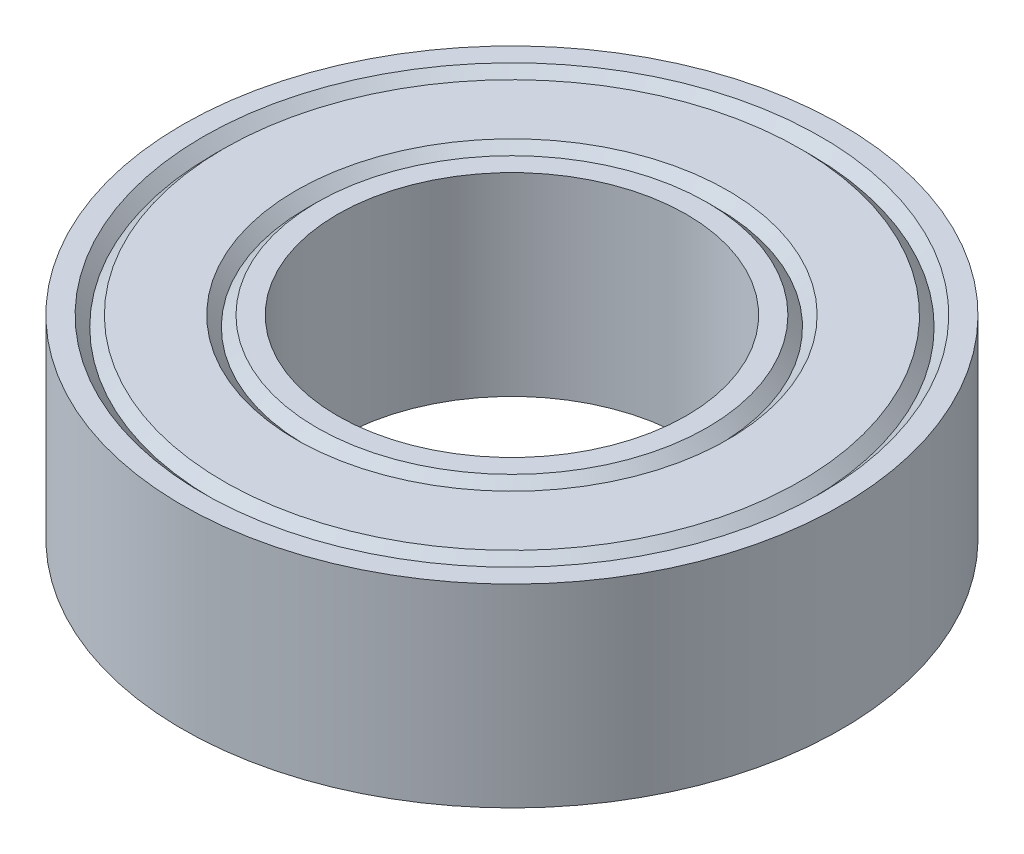
ISO-10303-21;
HEADER;
FILE_DESCRIPTION(('STEP AP214'),'2;1');
FILE_NAME('part.step','',(''),(''),'','','');
FILE_SCHEMA(('AUTOMOTIVE_DESIGN { 1 0 10303 214 1 1 1 1 }'));
ENDSEC;
DATA;
#1=APPLICATION_CONTEXT('core data for automotive mechanical design processes');
#2=APPLICATION_PROTOCOL_DEFINITION('international standard','automotive_design',2000,#1);
#3=PRODUCT_CONTEXT('',#1,'mechanical');
#4=PRODUCT('Part','Part','',(#3));
#5=PRODUCT_RELATED_PRODUCT_CATEGORY('part','',(#4));
#6=PRODUCT_DEFINITION_FORMATION('','',#4);
#7=PRODUCT_DEFINITION_CONTEXT('part definition',#1,'design');
#8=PRODUCT_DEFINITION('design','',#6,#7);
#9=PRODUCT_DEFINITION_SHAPE('','',#8);
#10=(LENGTH_UNIT() NAMED_UNIT(*) SI_UNIT(.MILLI.,.METRE.));
#11=(NAMED_UNIT(*) PLANE_ANGLE_UNIT() SI_UNIT($,.RADIAN.));
#12=(NAMED_UNIT(*) SI_UNIT($,.STERADIAN.) SOLID_ANGLE_UNIT());
#13=UNCERTAINTY_MEASURE_WITH_UNIT(LENGTH_MEASURE(1.E-05),#10,'distance_accuracy_value','');
#14=(GEOMETRIC_REPRESENTATION_CONTEXT(3) GLOBAL_UNCERTAINTY_ASSIGNED_CONTEXT((#13)) GLOBAL_UNIT_ASSIGNED_CONTEXT((#10,
#11,#12)) REPRESENTATION_CONTEXT('',''));
#15=CARTESIAN_POINT('',(0.,0.,0.));
#16=DIRECTION('',(0.,0.,1.));
#17=DIRECTION('',(1.,0.,0.));
#18=AXIS2_PLACEMENT_3D('',#15,#16,#17);
#19=CARTESIAN_POINT('',(0.,2.5,0.));
#20=DIRECTION('',(0.,1.,0.));
#21=DIRECTION('',(-1.,0.,0.));
#22=AXIS2_PLACEMENT_3D('',#19,#20,#21);
#23=CYLINDRICAL_SURFACE('',#22,4.5);
#24=CARTESIAN_POINT('',(0.,2.5,0.));
#25=DIRECTION('',(0.,1.,0.));
#26=DIRECTION('',(-1.,0.,0.));
#27=AXIS2_PLACEMENT_3D('',#24,#25,#26);
#28=CIRCLE('',#27,4.5);
#29=CARTESIAN_POINT('',(-4.5,2.5,0.));
#30=VERTEX_POINT('',#29);
#31=EDGE_CURVE('E83',#30,#30,#28,.T.);
#32=ORIENTED_EDGE('',*,*,#31,.T.);
#33=EDGE_LOOP('',(#32));
#34=FACE_BOUND('',#33,.T.);
#35=CARTESIAN_POINT('',(0.,-2.49999999999999,0.));
#36=DIRECTION('',(0.,1.,0.));
#37=DIRECTION('',(-1.,0.,0.));
#38=AXIS2_PLACEMENT_3D('',#35,#36,#37);
#39=CIRCLE('',#38,4.5);
#40=CARTESIAN_POINT('',(-4.5,-2.5,0.));
#41=VERTEX_POINT('',#40);
#42=EDGE_CURVE('E10',#41,#41,#39,.T.);
#43=ORIENTED_EDGE('',*,*,#42,.F.);
#44=EDGE_LOOP('',(#43));
#45=FACE_BOUND('',#44,.T.);
#46=ADVANCED_FACE('F31',(#34,#45),#23,.F.);
#47=CARTESIAN_POINT('',(-4.5,-2.5,0.));
#48=DIRECTION('',(0.,-1.,0.));
#49=DIRECTION('',(1.,0.,0.));
#50=AXIS2_PLACEMENT_3D('',#47,#48,#49);
#51=PLANE('',#50);
#52=ORIENTED_EDGE('',*,*,#42,.T.);
#53=EDGE_LOOP('',(#52));
#54=FACE_BOUND('',#53,.T.);
#55=CARTESIAN_POINT('',(0.,-2.49999999999999,0.));
#56=DIRECTION('',(0.,1.,0.));
#57=DIRECTION('',(-1.,0.,0.));
#58=AXIS2_PLACEMENT_3D('',#55,#56,#57);
#59=CIRCLE('',#58,5.03333333333334);
#60=CARTESIAN_POINT('',(-5.03333333333334,-2.49999999999999,0.));
#61=VERTEX_POINT('',#60);
#62=EDGE_CURVE('E37',#61,#61,#59,.T.);
#63=ORIENTED_EDGE('',*,*,#62,.F.);
#64=EDGE_LOOP('',(#63));
#65=FACE_BOUND('',#64,.T.);
#66=ADVANCED_FACE('F101',(#54,#65),#51,.T.);
#67=CARTESIAN_POINT('',(0.,-2.23333333333332,0.));
#68=DIRECTION('',(0.,1.,0.));
#69=DIRECTION('',(-1.,0.,0.));
#70=AXIS2_PLACEMENT_3D('',#67,#68,#69);
#71=CONICAL_SURFACE('',#70,5.3,0.785398163397442);
#72=ORIENTED_EDGE('',*,*,#62,.T.);
#73=EDGE_LOOP('',(#72));
#74=FACE_BOUND('',#73,.T.);
#75=CARTESIAN_POINT('',(0.,-2.23333333333332,0.));
#76=DIRECTION('',(0.,1.,0.));
#77=DIRECTION('',(-1.,0.,0.));
#78=AXIS2_PLACEMENT_3D('',#75,#76,#77);
#79=CIRCLE('',#78,5.3);
#80=CARTESIAN_POINT('',(-5.3,-2.23333333333333,0.));
#81=VERTEX_POINT('',#80);
#82=EDGE_CURVE('E41',#81,#81,#79,.T.);
#83=ORIENTED_EDGE('',*,*,#82,.F.);
#84=EDGE_LOOP('',(#83));
#85=FACE_BOUND('',#84,.T.);
#86=ADVANCED_FACE('F105',(#74,#85),#71,.T.);
#87=CARTESIAN_POINT('',(0.,-2.5,0.));
#88=DIRECTION('',(0.,-1.,0.));
#89=DIRECTION('',(1.,0.,0.));
#90=AXIS2_PLACEMENT_3D('',#87,#88,#89);
#91=CONICAL_SURFACE('',#90,5.56666666666668,0.785398163397457);
#92=ORIENTED_EDGE('',*,*,#82,.T.);
#93=EDGE_LOOP('',(#92));
#94=FACE_BOUND('',#93,.T.);
#95=CARTESIAN_POINT('',(0.,-2.5,0.));
#96=DIRECTION('',(0.,1.,0.));
#97=DIRECTION('',(-1.,0.,0.));
#98=AXIS2_PLACEMENT_3D('',#95,#96,#97);
#99=CIRCLE('',#98,5.56666666666668);
#100=CARTESIAN_POINT('',(-5.56666666666668,-2.5,0.));
#101=VERTEX_POINT('',#100);
#102=EDGE_CURVE('E45',#101,#101,#99,.T.);
#103=ORIENTED_EDGE('',*,*,#102,.F.);
#104=EDGE_LOOP('',(#103));
#105=FACE_BOUND('',#104,.T.);
#106=ADVANCED_FACE('F109',(#94,#105),#91,.F.);
#107=CARTESIAN_POINT('',(-5.56666666666668,-2.49999999999999,0.));
#108=DIRECTION('',(0.,-1.,0.));
#109=DIRECTION('',(1.,0.,0.));
#110=AXIS2_PLACEMENT_3D('',#107,#108,#109);
#111=PLANE('',#110);
#112=ORIENTED_EDGE('',*,*,#102,.T.);
#113=EDGE_LOOP('',(#112));
#114=FACE_BOUND('',#113,.T.);
#115=CARTESIAN_POINT('',(0.,-2.49999999999999,0.));
#116=DIRECTION('',(0.,1.,0.));
#117=DIRECTION('',(-1.,0.,0.));
#118=AXIS2_PLACEMENT_3D('',#115,#116,#117);
#119=CIRCLE('',#118,7.43333333333333);
#120=CARTESIAN_POINT('',(-7.43333333333333,-2.49999999999999,0.));
#121=VERTEX_POINT('',#120);
#122=EDGE_CURVE('E50',#121,#121,#119,.T.);
#123=ORIENTED_EDGE('',*,*,#122,.F.);
#124=EDGE_LOOP('',(#123));
#125=FACE_BOUND('',#124,.T.);
#126=ADVANCED_FACE('F115',(#114,#125),#111,.T.);
#127=CARTESIAN_POINT('',(0.,-2.23333333333332,0.));
#128=DIRECTION('',(0.,1.,0.));
#129=DIRECTION('',(-1.,0.,0.));
#130=AXIS2_PLACEMENT_3D('',#127,#128,#129);
#131=CONICAL_SURFACE('',#130,7.7,0.785398163397461);
#132=ORIENTED_EDGE('',*,*,#122,.T.);
#133=EDGE_LOOP('',(#132));
#134=FACE_BOUND('',#133,.T.);
#135=CARTESIAN_POINT('',(0.,-2.23333333333332,0.));
#136=DIRECTION('',(0.,1.,0.));
#137=DIRECTION('',(-1.,0.,0.));
#138=AXIS2_PLACEMENT_3D('',#135,#136,#137);
#139=CIRCLE('',#138,7.7);
#140=CARTESIAN_POINT('',(-7.7,-2.23333333333333,0.));
#141=VERTEX_POINT('',#140);
#142=EDGE_CURVE('E53',#141,#141,#139,.T.);
#143=ORIENTED_EDGE('',*,*,#142,.F.);
#144=EDGE_LOOP('',(#143));
#145=FACE_BOUND('',#144,.T.);
#146=ADVANCED_FACE('F119',(#134,#145),#131,.T.);
#147=CARTESIAN_POINT('',(0.,-2.49999999999999,0.));
#148=DIRECTION('',(0.,-1.,0.));
#149=DIRECTION('',(1.,0.,0.));
#150=AXIS2_PLACEMENT_3D('',#147,#148,#149);
#151=CONICAL_SURFACE('',#150,7.96666666666667,0.785398163397442);
#152=ORIENTED_EDGE('',*,*,#142,.T.);
#153=EDGE_LOOP('',(#152));
#154=FACE_BOUND('',#153,.T.);
#155=CARTESIAN_POINT('',(0.,-2.49999999999999,0.));
#156=DIRECTION('',(0.,1.,0.));
#157=DIRECTION('',(-1.,0.,0.));
#158=AXIS2_PLACEMENT_3D('',#155,#156,#157);
#159=CIRCLE('',#158,7.96666666666667);
#160=CARTESIAN_POINT('',(-7.96666666666667,-2.5,0.));
#161=VERTEX_POINT('',#160);
#162=EDGE_CURVE('E56',#161,#161,#159,.T.);
#163=ORIENTED_EDGE('',*,*,#162,.F.);
#164=EDGE_LOOP('',(#163));
#165=FACE_BOUND('',#164,.T.);
#166=ADVANCED_FACE('F123',(#154,#165),#151,.F.);
#167=CARTESIAN_POINT('',(-7.96666666666667,-2.5,0.));
#168=DIRECTION('',(0.,-1.,0.));
#169=DIRECTION('',(1.,0.,0.));
#170=AXIS2_PLACEMENT_3D('',#167,#168,#169);
#171=PLANE('',#170);
#172=ORIENTED_EDGE('',*,*,#162,.T.);
#173=EDGE_LOOP('',(#172));
#174=FACE_BOUND('',#173,.T.);
#175=CARTESIAN_POINT('',(0.,-2.49999999999999,0.));
#176=DIRECTION('',(0.,1.,0.));
#177=DIRECTION('',(-1.,0.,0.));
#178=AXIS2_PLACEMENT_3D('',#175,#176,#177);
#179=CIRCLE('',#178,8.5);
#180=CARTESIAN_POINT('',(-8.5,-2.5,0.));
#181=VERTEX_POINT('',#180);
#182=EDGE_CURVE('E59',#181,#181,#179,.T.);
#183=ORIENTED_EDGE('',*,*,#182,.F.);
#184=EDGE_LOOP('',(#183));
#185=FACE_BOUND('',#184,.T.);
#186=ADVANCED_FACE('F127',(#174,#185),#171,.T.);
#187=CARTESIAN_POINT('',(0.,2.5,0.));
#188=DIRECTION('',(0.,1.,0.));
#189=DIRECTION('',(-1.,0.,0.));
#190=AXIS2_PLACEMENT_3D('',#187,#188,#189);
#191=CYLINDRICAL_SURFACE('',#190,8.5);
#192=ORIENTED_EDGE('',*,*,#182,.T.);
#193=EDGE_LOOP('',(#192));
#194=FACE_BOUND('',#193,.T.);
#195=CARTESIAN_POINT('',(0.,2.5,0.));
#196=DIRECTION('',(0.,1.,0.));
#197=DIRECTION('',(-1.,0.,0.));
#198=AXIS2_PLACEMENT_3D('',#195,#196,#197);
#199=CIRCLE('',#198,8.5);
#200=CARTESIAN_POINT('',(-8.5,2.5,0.));
#201=VERTEX_POINT('',#200);
#202=EDGE_CURVE('E62',#201,#201,#199,.T.);
#203=ORIENTED_EDGE('',*,*,#202,.F.);
#204=EDGE_LOOP('',(#203));
#205=FACE_BOUND('',#204,.T.);
#206=ADVANCED_FACE('F131',(#194,#205),#191,.T.);
#207=CARTESIAN_POINT('',(-7.96666666666667,2.5,0.));
#208=DIRECTION('',(0.,1.,0.));
#209=DIRECTION('',(-1.,0.,0.));
#210=AXIS2_PLACEMENT_3D('',#207,#208,#209);
#211=PLANE('',#210);
#212=ORIENTED_EDGE('',*,*,#202,.T.);
#213=EDGE_LOOP('',(#212));
#214=FACE_BOUND('',#213,.T.);
#215=CARTESIAN_POINT('',(0.,2.5,0.));
#216=DIRECTION('',(0.,1.,0.));
#217=DIRECTION('',(-1.,0.,0.));
#218=AXIS2_PLACEMENT_3D('',#215,#216,#217);
#219=CIRCLE('',#218,7.96666666666667);
#220=CARTESIAN_POINT('',(-7.96666666666667,2.5,0.));
#221=VERTEX_POINT('',#220);
#222=EDGE_CURVE('E65',#221,#221,#219,.T.);
#223=ORIENTED_EDGE('',*,*,#222,.F.);
#224=EDGE_LOOP('',(#223));
#225=FACE_BOUND('',#224,.T.);
#226=ADVANCED_FACE('F135',(#214,#225),#211,.T.);
#227=CARTESIAN_POINT('',(0.,2.23333333333333,0.));
#228=DIRECTION('',(0.,1.,0.));
#229=DIRECTION('',(-1.,0.,0.));
#230=AXIS2_PLACEMENT_3D('',#227,#228,#229);
#231=CONICAL_SURFACE('',#230,7.7,0.785398163397441);
#232=ORIENTED_EDGE('',*,*,#222,.T.);
#233=EDGE_LOOP('',(#232));
#234=FACE_BOUND('',#233,.T.);
#235=CARTESIAN_POINT('',(0.,2.23333333333333,0.));
#236=DIRECTION('',(0.,1.,0.));
#237=DIRECTION('',(-1.,0.,0.));
#238=AXIS2_PLACEMENT_3D('',#235,#236,#237);
#239=CIRCLE('',#238,7.7);
#240=CARTESIAN_POINT('',(-7.7,2.23333333333333,0.));
#241=VERTEX_POINT('',#240);
#242=EDGE_CURVE('E68',#241,#241,#239,.T.);
#243=ORIENTED_EDGE('',*,*,#242,.F.);
#244=EDGE_LOOP('',(#243));
#245=FACE_BOUND('',#244,.T.);
#246=ADVANCED_FACE('F139',(#234,#245),#231,.F.);
#247=CARTESIAN_POINT('',(0.,2.5,0.));
#248=DIRECTION('',(0.,-1.,0.));
#249=DIRECTION('',(1.,0.,0.));
#250=AXIS2_PLACEMENT_3D('',#247,#248,#249);
#251=CONICAL_SURFACE('',#250,7.43333333333333,0.785398163397464);
#252=ORIENTED_EDGE('',*,*,#242,.T.);
#253=EDGE_LOOP('',(#252));
#254=FACE_BOUND('',#253,.T.);
#255=CARTESIAN_POINT('',(0.,2.5,0.));
#256=DIRECTION('',(0.,1.,0.));
#257=DIRECTION('',(-1.,0.,0.));
#258=AXIS2_PLACEMENT_3D('',#255,#256,#257);
#259=CIRCLE('',#258,7.43333333333333);
#260=CARTESIAN_POINT('',(-7.43333333333333,2.49999999999999,0.));
#261=VERTEX_POINT('',#260);
#262=EDGE_CURVE('E71',#261,#261,#259,.T.);
#263=ORIENTED_EDGE('',*,*,#262,.F.);
#264=EDGE_LOOP('',(#263));
#265=FACE_BOUND('',#264,.T.);
#266=ADVANCED_FACE('F143',(#254,#265),#251,.T.);
#267=CARTESIAN_POINT('',(-5.56666666666668,2.5,0.));
#268=DIRECTION('',(0.,1.,0.));
#269=DIRECTION('',(-1.,0.,0.));
#270=AXIS2_PLACEMENT_3D('',#267,#268,#269);
#271=PLANE('',#270);
#272=ORIENTED_EDGE('',*,*,#262,.T.);
#273=EDGE_LOOP('',(#272));
#274=FACE_BOUND('',#273,.T.);
#275=CARTESIAN_POINT('',(0.,2.5,0.));
#276=DIRECTION('',(0.,1.,0.));
#277=DIRECTION('',(-1.,0.,0.));
#278=AXIS2_PLACEMENT_3D('',#275,#276,#277);
#279=CIRCLE('',#278,5.56666666666668);
#280=CARTESIAN_POINT('',(-5.56666666666668,2.5,0.));
#281=VERTEX_POINT('',#280);
#282=EDGE_CURVE('E74',#281,#281,#279,.T.);
#283=ORIENTED_EDGE('',*,*,#282,.F.);
#284=EDGE_LOOP('',(#283));
#285=FACE_BOUND('',#284,.T.);
#286=ADVANCED_FACE('F147',(#274,#285),#271,.T.);
#287=CARTESIAN_POINT('',(0.,2.23333333333333,0.));
#288=DIRECTION('',(0.,1.,0.));
#289=DIRECTION('',(-1.,0.,0.));
#290=AXIS2_PLACEMENT_3D('',#287,#288,#289);
#291=CONICAL_SURFACE('',#290,5.3,0.785398163397459);
#292=ORIENTED_EDGE('',*,*,#282,.T.);
#293=EDGE_LOOP('',(#292));
#294=FACE_BOUND('',#293,.T.);
#295=CARTESIAN_POINT('',(0.,2.23333333333333,0.));
#296=DIRECTION('',(0.,1.,0.));
#297=DIRECTION('',(-1.,0.,0.));
#298=AXIS2_PLACEMENT_3D('',#295,#296,#297);
#299=CIRCLE('',#298,5.3);
#300=CARTESIAN_POINT('',(-5.3,2.23333333333333,0.));
#301=VERTEX_POINT('',#300);
#302=EDGE_CURVE('E77',#301,#301,#299,.T.);
#303=ORIENTED_EDGE('',*,*,#302,.F.);
#304=EDGE_LOOP('',(#303));
#305=FACE_BOUND('',#304,.T.);
#306=ADVANCED_FACE('F97',(#294,#305),#291,.F.);
#307=CARTESIAN_POINT('',(0.,2.5,0.));
#308=DIRECTION('',(0.,-1.,0.));
#309=DIRECTION('',(1.,0.,0.));
#310=AXIS2_PLACEMENT_3D('',#307,#308,#309);
#311=CONICAL_SURFACE('',#310,5.03333333333334,0.785398163397439);
#312=ORIENTED_EDGE('',*,*,#302,.T.);
#313=EDGE_LOOP('',(#312));
#314=FACE_BOUND('',#313,.T.);
#315=CARTESIAN_POINT('',(0.,2.5,0.));
#316=DIRECTION('',(0.,1.,0.));
#317=DIRECTION('',(-1.,0.,0.));
#318=AXIS2_PLACEMENT_3D('',#315,#316,#317);
#319=CIRCLE('',#318,5.03333333333334);
#320=CARTESIAN_POINT('',(-5.03333333333334,2.5,0.));
#321=VERTEX_POINT('',#320);
#322=EDGE_CURVE('E80',#321,#321,#319,.T.);
#323=ORIENTED_EDGE('',*,*,#322,.F.);
#324=EDGE_LOOP('',(#323));
#325=FACE_BOUND('',#324,.T.);
#326=ADVANCED_FACE('F91',(#314,#325),#311,.T.);
#327=CARTESIAN_POINT('',(-4.5,2.5,0.));
#328=DIRECTION('',(0.,1.,0.));
#329=DIRECTION('',(-1.,0.,0.));
#330=AXIS2_PLACEMENT_3D('',#327,#328,#329);
#331=PLANE('',#330);
#332=ORIENTED_EDGE('',*,*,#322,.T.);
#333=EDGE_LOOP('',(#332));
#334=FACE_BOUND('',#333,.T.);
#335=ORIENTED_EDGE('',*,*,#31,.F.);
#336=EDGE_LOOP('',(#335));
#337=FACE_BOUND('',#336,.T.);
#338=ADVANCED_FACE('F89',(#334,#337),#331,.T.);
#339=CLOSED_SHELL('',(#46,#66,#86,#106,#126,#146,#166,#186,#206,#226,#246,#266,#286,#306,#326,#338));
#340=MANIFOLD_SOLID_BREP('B2',#339);
#341=ADVANCED_BREP_SHAPE_REPRESENTATION('',(#18,#340),#14);
#342=SHAPE_DEFINITION_REPRESENTATION(#9,#341);
ENDSEC;
END-ISO-10303-21;
